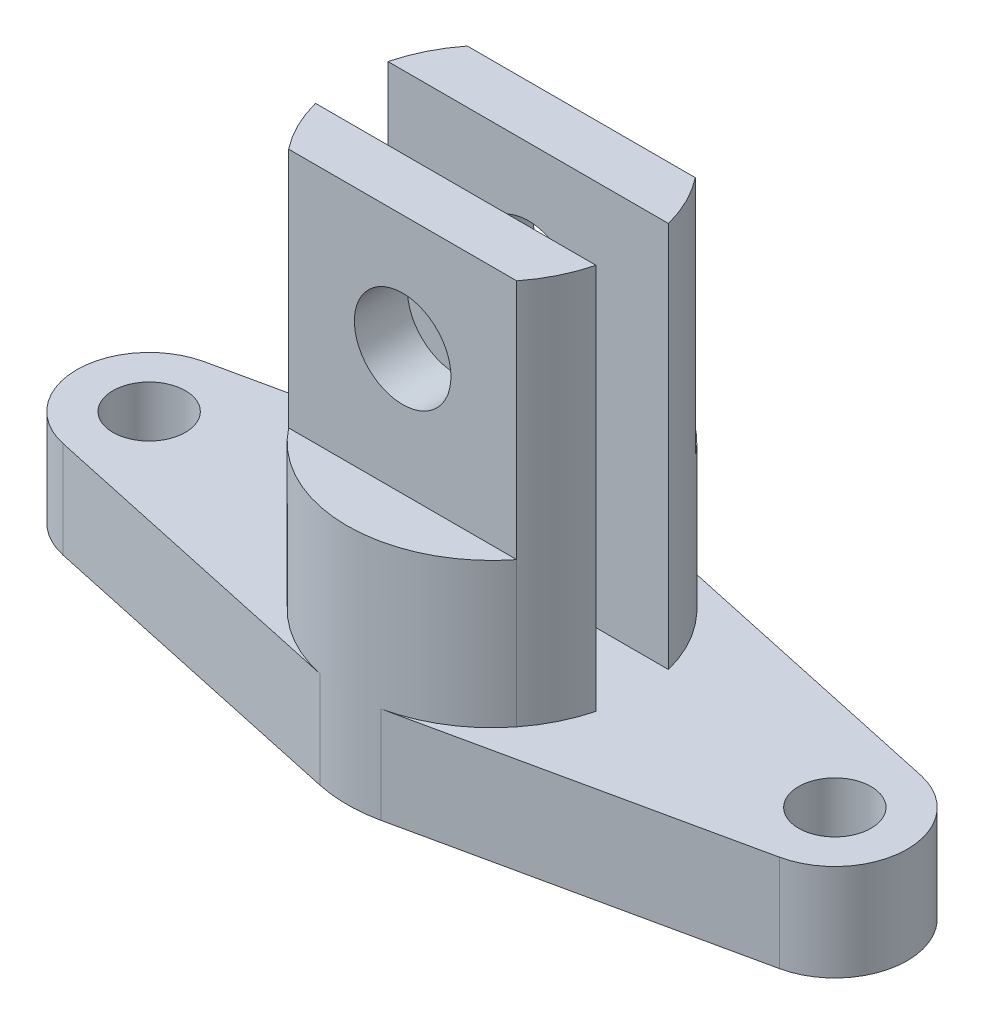
ISO-10303-21;
HEADER;
FILE_DESCRIPTION(('STEP AP214'),'2;1');
FILE_NAME('part.step','',(''),(''),'','','');
FILE_SCHEMA(('AUTOMOTIVE_DESIGN { 1 0 10303 214 1 1 1 1 }'));
ENDSEC;
DATA;
#1=APPLICATION_CONTEXT('core data for automotive mechanical design processes');
#2=APPLICATION_PROTOCOL_DEFINITION('international standard','automotive_design',2000,#1);
#3=PRODUCT_CONTEXT('',#1,'mechanical');
#4=PRODUCT('Part','Part','',(#3));
#5=PRODUCT_RELATED_PRODUCT_CATEGORY('part','',(#4));
#6=PRODUCT_DEFINITION_FORMATION('','',#4);
#7=PRODUCT_DEFINITION_CONTEXT('part definition',#1,'design');
#8=PRODUCT_DEFINITION('design','',#6,#7);
#9=PRODUCT_DEFINITION_SHAPE('','',#8);
#10=(LENGTH_UNIT() NAMED_UNIT(*) SI_UNIT(.MILLI.,.METRE.));
#11=(NAMED_UNIT(*) PLANE_ANGLE_UNIT() SI_UNIT($,.RADIAN.));
#12=(NAMED_UNIT(*) SI_UNIT($,.STERADIAN.) SOLID_ANGLE_UNIT());
#13=UNCERTAINTY_MEASURE_WITH_UNIT(LENGTH_MEASURE(1.E-05),#10,'distance_accuracy_value','');
#14=(GEOMETRIC_REPRESENTATION_CONTEXT(3) GLOBAL_UNCERTAINTY_ASSIGNED_CONTEXT((#13)) GLOBAL_UNIT_ASSIGNED_CONTEXT((#10,
#11,#12)) REPRESENTATION_CONTEXT('',''));
#15=CARTESIAN_POINT('',(0.,0.,0.));
#16=DIRECTION('',(0.,0.,1.));
#17=DIRECTION('',(1.,0.,0.));
#18=AXIS2_PLACEMENT_3D('',#15,#16,#17);
#19=CARTESIAN_POINT('',(0.,20.,0.));
#20=DIRECTION('',(0.,1.,0.));
#21=DIRECTION('',(0.,0.,1.));
#22=AXIS2_PLACEMENT_3D('',#19,#20,#21);
#23=PLANE('',#22);
#24=CARTESIAN_POINT('',(0.,20.,0.));
#25=DIRECTION('',(0.,1.,0.));
#26=DIRECTION('',(0.,0.,1.));
#27=AXIS2_PLACEMENT_3D('',#24,#25,#26);
#28=CIRCLE('',#27,30.);
#29=CARTESIAN_POINT('',(-29.0473750965556,20.,7.50000000000001));
#30=VERTEX_POINT('',#29);
#31=CARTESIAN_POINT('',(-6.33802816901409,20.,29.3228477288408));
#32=VERTEX_POINT('',#31);
#33=EDGE_CURVE('E289',#30,#32,#28,.T.);
#34=ORIENTED_EDGE('',*,*,#33,.F.);
#35=DIRECTION('',(1.,0.,0.));
#36=VECTOR('',#35,1.);
#37=CARTESIAN_POINT('',(-29.0473750965556,20.,7.50000000000001));
#38=LINE('',#37,#36);
#39=CARTESIAN_POINT('',(29.0473750965556,20.,7.49999999999998));
#40=VERTEX_POINT('',#39);
#41=EDGE_CURVE('E501',#30,#40,#38,.T.);
#42=ORIENTED_EDGE('',*,*,#41,.T.);
#43=CARTESIAN_POINT('',(-4.60295909374131E-06,20.,-2.27245735076598E-06));
#44=DIRECTION('',(0.,-1.,0.));
#45=DIRECTION('',(0.,0.,-1.));
#46=AXIS2_PLACEMENT_3D('',#43,#44,#45);
#47=CIRCLE('',#46,30.0000050249103);
#48=CARTESIAN_POINT('',(23.6167313572391,20.,18.5));
#49=VERTEX_POINT('',#48);
#50=EDGE_CURVE('E497',#40,#49,#47,.T.);
#51=ORIENTED_EDGE('',*,*,#50,.T.);
#52=CARTESIAN_POINT('',(0.,20.,0.));
#53=DIRECTION('',(0.,1.,0.));
#54=DIRECTION('',(0.,0.,1.));
#55=AXIS2_PLACEMENT_3D('',#52,#53,#54);
#56=CIRCLE('',#55,30.);
#57=CARTESIAN_POINT('',(6.33802816901409,20.,29.3228477288408));
#58=VERTEX_POINT('',#57);
#59=EDGE_CURVE('E11',#49,#58,#56,.F.);
#60=ORIENTED_EDGE('',*,*,#59,.T.);
#61=DIRECTION('',(0.977428257628027,0.,-0.211267605633803));
#62=VECTOR('',#61,1.);
#63=CARTESIAN_POINT('',(6.33802816901409,20.,29.3228477288408));
#64=LINE('',#63,#62);
#65=CARTESIAN_POINT('',(74.169014084507,20.,14.6614238644204));
#66=VERTEX_POINT('',#65);
#67=EDGE_CURVE('E251',#58,#66,#64,.T.);
#68=ORIENTED_EDGE('',*,*,#67,.T.);
#69=CARTESIAN_POINT('',(71.,20.,0.));
#70=DIRECTION('',(0.,1.,0.));
#71=DIRECTION('',(0.,0.,1.));
#72=AXIS2_PLACEMENT_3D('',#69,#70,#71);
#73=CIRCLE('',#72,15.);
#74=CARTESIAN_POINT('',(74.169014084507,20.,-14.6614238644204));
#75=VERTEX_POINT('',#74);
#76=EDGE_CURVE('E109',#66,#75,#73,.T.);
#77=ORIENTED_EDGE('',*,*,#76,.T.);
#78=DIRECTION('',(0.977428257628027,0.,0.211267605633803));
#79=VECTOR('',#78,1.);
#80=CARTESIAN_POINT('',(6.33802816901407,20.,-29.3228477288408));
#81=LINE('',#80,#79);
#82=CARTESIAN_POINT('',(6.33802816901407,20.,-29.3228477288408));
#83=VERTEX_POINT('',#82);
#84=EDGE_CURVE('E150',#83,#75,#81,.T.);
#85=ORIENTED_EDGE('',*,*,#84,.F.);
#86=CARTESIAN_POINT('',(0.,20.,0.));
#87=DIRECTION('',(0.,1.,0.));
#88=DIRECTION('',(0.,0.,1.));
#89=AXIS2_PLACEMENT_3D('',#86,#87,#88);
#90=CIRCLE('',#89,30.);
#91=CARTESIAN_POINT('',(29.0473750965556,20.,-7.5));
#92=VERTEX_POINT('',#91);
#93=EDGE_CURVE('E135',#92,#83,#90,.T.);
#94=ORIENTED_EDGE('',*,*,#93,.F.);
#95=DIRECTION('',(1.,0.,0.));
#96=VECTOR('',#95,1.);
#97=CARTESIAN_POINT('',(0.,20.,-7.5));
#98=LINE('',#97,#96);
#99=CARTESIAN_POINT('',(-29.0473750965556,20.,-7.49999999999999));
#100=VERTEX_POINT('',#99);
#101=EDGE_CURVE('E128',#100,#92,#98,.T.);
#102=ORIENTED_EDGE('',*,*,#101,.F.);
#103=CARTESIAN_POINT('',(-6.33802816901409,20.,-29.3228477288408));
#104=VERTEX_POINT('',#103);
#105=EDGE_CURVE('E54',#104,#100,#90,.T.);
#106=ORIENTED_EDGE('',*,*,#105,.F.);
#107=DIRECTION('',(0.977428257628027,0.,-0.211267605633803));
#108=VECTOR('',#107,1.);
#109=CARTESIAN_POINT('',(-6.33802816901409,20.,-29.3228477288408));
#110=LINE('',#109,#108);
#111=CARTESIAN_POINT('',(-74.169014084507,20.,-14.6614238644204));
#112=VERTEX_POINT('',#111);
#113=EDGE_CURVE('E124',#112,#104,#110,.T.);
#114=ORIENTED_EDGE('',*,*,#113,.F.);
#115=CARTESIAN_POINT('',(-71.,20.,0.));
#116=DIRECTION('',(0.,1.,0.));
#117=DIRECTION('',(0.,0.,1.));
#118=AXIS2_PLACEMENT_3D('',#115,#116,#117);
#119=CIRCLE('',#118,15.);
#120=CARTESIAN_POINT('',(-74.169014084507,20.,14.6614238644204));
#121=VERTEX_POINT('',#120);
#122=EDGE_CURVE('E62',#112,#121,#119,.T.);
#123=ORIENTED_EDGE('',*,*,#122,.T.);
#124=DIRECTION('',(0.977428257628027,0.,0.211267605633803));
#125=VECTOR('',#124,1.);
#126=CARTESIAN_POINT('',(-6.33802816901409,20.,29.3228477288408));
#127=LINE('',#126,#125);
#128=EDGE_CURVE('E154',#121,#32,#127,.T.);
#129=ORIENTED_EDGE('',*,*,#128,.T.);
#130=EDGE_LOOP('',(#34,#42,#51,#60,#68,#77,#85,#94,#102,#106,#114,#123,#129));
#131=FACE_BOUND('',#130,.T.);
#132=CARTESIAN_POINT('',(71.,20.,0.));
#133=DIRECTION('',(0.,1.,0.));
#134=DIRECTION('',(0.,0.,1.));
#135=AXIS2_PLACEMENT_3D('',#132,#133,#134);
#136=CIRCLE('',#135,7.50000000000001);
#137=CARTESIAN_POINT('',(71.,20.,7.50000000000001));
#138=VERTEX_POINT('',#137);
#139=EDGE_CURVE('E200',#138,#138,#136,.T.);
#140=ORIENTED_EDGE('',*,*,#139,.F.);
#141=EDGE_LOOP('',(#140));
#142=FACE_BOUND('',#141,.T.);
#143=CARTESIAN_POINT('',(-71.,20.,0.));
#144=DIRECTION('',(0.,1.,0.));
#145=DIRECTION('',(0.,0.,1.));
#146=AXIS2_PLACEMENT_3D('',#143,#144,#145);
#147=CIRCLE('',#146,7.5);
#148=CARTESIAN_POINT('',(-71.,20.,7.5));
#149=VERTEX_POINT('',#148);
#150=EDGE_CURVE('E162',#149,#149,#147,.T.);
#151=ORIENTED_EDGE('',*,*,#150,.F.);
#152=EDGE_LOOP('',(#151));
#153=FACE_BOUND('',#152,.T.);
#154=ADVANCED_FACE('F43',(#131,#142,#153),#23,.T.);
#155=CARTESIAN_POINT('',(6.33802816901409,20.,29.3228477288408));
#156=DIRECTION('',(-0.211267605633803,0.,-0.977428257628027));
#157=DIRECTION('',(-0.977428257628027,0.,0.211267605633803));
#158=AXIS2_PLACEMENT_3D('',#155,#156,#157);
#159=PLANE('',#158);
#160=DIRECTION('',(0.977428257628027,0.,-0.211267605633803));
#161=VECTOR('',#160,1.);
#162=CARTESIAN_POINT('',(6.33802816901409,0.,29.3228477288408));
#163=LINE('',#162,#161);
#164=CARTESIAN_POINT('',(6.33802816901409,0.,29.3228477288408));
#165=VERTEX_POINT('',#164);
#166=CARTESIAN_POINT('',(74.169014084507,0.,14.6614238644204));
#167=VERTEX_POINT('',#166);
#168=EDGE_CURVE('E171',#165,#167,#163,.T.);
#169=ORIENTED_EDGE('',*,*,#168,.T.);
#170=DIRECTION('',(0.,-1.,0.));
#171=VECTOR('',#170,1.);
#172=CARTESIAN_POINT('',(74.169014084507,20.,14.6614238644204));
#173=LINE('',#172,#171);
#174=EDGE_CURVE('E133',#66,#167,#173,.T.);
#175=ORIENTED_EDGE('',*,*,#174,.F.);
#176=ORIENTED_EDGE('',*,*,#67,.F.);
#177=DIRECTION('',(0.,-1.,0.));
#178=VECTOR('',#177,1.);
#179=CARTESIAN_POINT('',(6.33802816901409,20.,29.3228477288408));
#180=LINE('',#179,#178);
#181=EDGE_CURVE('E166',#58,#165,#180,.T.);
#182=ORIENTED_EDGE('',*,*,#181,.T.);
#183=EDGE_LOOP('',(#169,#175,#176,#182));
#184=FACE_BOUND('',#183,.T.);
#185=ADVANCED_FACE('F222',(#184),#159,.F.);
#186=CARTESIAN_POINT('',(71.,20.,0.));
#187=DIRECTION('',(0.,-1.,0.));
#188=DIRECTION('',(0.,0.,-1.));
#189=AXIS2_PLACEMENT_3D('',#186,#187,#188);
#190=CYLINDRICAL_SURFACE('',#189,15.);
#191=CARTESIAN_POINT('',(71.,0.,0.));
#192=DIRECTION('',(0.,1.,0.));
#193=DIRECTION('',(0.,0.,1.));
#194=AXIS2_PLACEMENT_3D('',#191,#192,#193);
#195=CIRCLE('',#194,15.);
#196=CARTESIAN_POINT('',(74.169014084507,0.,-14.6614238644204));
#197=VERTEX_POINT('',#196);
#198=EDGE_CURVE('E176',#167,#197,#195,.T.);
#199=ORIENTED_EDGE('',*,*,#198,.T.);
#200=DIRECTION('',(0.,-1.,0.));
#201=VECTOR('',#200,1.);
#202=CARTESIAN_POINT('',(74.169014084507,20.,-14.6614238644204));
#203=LINE('',#202,#201);
#204=EDGE_CURVE('E213',#75,#197,#203,.T.);
#205=ORIENTED_EDGE('',*,*,#204,.F.);
#206=ORIENTED_EDGE('',*,*,#76,.F.);
#207=ORIENTED_EDGE('',*,*,#174,.T.);
#208=EDGE_LOOP('',(#199,#205,#206,#207));
#209=FACE_BOUND('',#208,.T.);
#210=ADVANCED_FACE('F218',(#209),#190,.T.);
#211=CARTESIAN_POINT('',(6.33802816901407,20.,-29.3228477288408));
#212=DIRECTION('',(0.211267605633802,0.,-0.977428257628027));
#213=DIRECTION('',(-0.977428257628027,0.,-0.211267605633802));
#214=AXIS2_PLACEMENT_3D('',#211,#212,#213);
#215=PLANE('',#214);
#216=DIRECTION('',(0.977428257628027,0.,0.211267605633803));
#217=VECTOR('',#216,1.);
#218=CARTESIAN_POINT('',(6.33802816901407,0.,-29.3228477288408));
#219=LINE('',#218,#217);
#220=CARTESIAN_POINT('',(6.33802816901407,0.,-29.3228477288408));
#221=VERTEX_POINT('',#220);
#222=EDGE_CURVE('E180',#221,#197,#219,.T.);
#223=ORIENTED_EDGE('',*,*,#222,.F.);
#224=DIRECTION('',(0.,-1.,0.));
#225=VECTOR('',#224,1.);
#226=CARTESIAN_POINT('',(6.33802816901407,20.,-29.3228477288408));
#227=LINE('',#226,#225);
#228=EDGE_CURVE('E145',#83,#221,#227,.T.);
#229=ORIENTED_EDGE('',*,*,#228,.F.);
#230=ORIENTED_EDGE('',*,*,#84,.T.);
#231=ORIENTED_EDGE('',*,*,#204,.T.);
#232=EDGE_LOOP('',(#223,#229,#230,#231));
#233=FACE_BOUND('',#232,.T.);
#234=ADVANCED_FACE('F228',(#233),#215,.T.);
#235=CARTESIAN_POINT('',(0.,20.,0.));
#236=DIRECTION('',(0.,-1.,0.));
#237=DIRECTION('',(0.,0.,-1.));
#238=AXIS2_PLACEMENT_3D('',#235,#236,#237);
#239=CYLINDRICAL_SURFACE('',#238,30.);
#240=CARTESIAN_POINT('',(0.,0.,0.));
#241=DIRECTION('',(0.,1.,0.));
#242=DIRECTION('',(0.,0.,1.));
#243=AXIS2_PLACEMENT_3D('',#240,#241,#242);
#244=CIRCLE('',#243,30.);
#245=CARTESIAN_POINT('',(-6.33802816901409,0.,-29.3228477288408));
#246=VERTEX_POINT('',#245);
#247=EDGE_CURVE('E140',#221,#246,#244,.T.);
#248=ORIENTED_EDGE('',*,*,#247,.T.);
#249=DIRECTION('',(0.,-1.,0.));
#250=VECTOR('',#249,1.);
#251=CARTESIAN_POINT('',(-6.33802816901409,20.,-29.3228477288408));
#252=LINE('',#251,#250);
#253=EDGE_CURVE('E137',#104,#246,#252,.T.);
#254=ORIENTED_EDGE('',*,*,#253,.F.);
#255=ORIENTED_EDGE('',*,*,#105,.T.);
#256=DIRECTION('',(0.,-1.,0.));
#257=VECTOR('',#256,1.);
#258=CARTESIAN_POINT('',(-29.0473750965556,100.,-7.49999999999999));
#259=LINE('',#258,#257);
#260=CARTESIAN_POINT('',(-29.0473750965556,100.,-7.49999999999999));
#261=VERTEX_POINT('',#260);
#262=EDGE_CURVE('E279',#261,#100,#259,.T.);
#263=ORIENTED_EDGE('',*,*,#262,.F.);
#264=CARTESIAN_POINT('',(0.,100.,0.));
#265=DIRECTION('',(0.,1.,0.));
#266=DIRECTION('',(0.,0.,1.));
#267=AXIS2_PLACEMENT_3D('',#264,#265,#266);
#268=CIRCLE('',#267,30.);
#269=CARTESIAN_POINT('',(-23.6167313572391,100.,-18.5));
#270=VERTEX_POINT('',#269);
#271=EDGE_CURVE('E274',#270,#261,#268,.T.);
#272=ORIENTED_EDGE('',*,*,#271,.F.);
#273=DIRECTION('',(0.,-1.,0.));
#274=VECTOR('',#273,1.);
#275=CARTESIAN_POINT('',(-23.6167313572391,100.,-18.5));
#276=LINE('',#275,#274);
#277=CARTESIAN_POINT('',(-23.6167313572391,50.,-18.5));
#278=VERTEX_POINT('',#277);
#279=EDGE_CURVE('E271',#270,#278,#276,.T.);
#280=ORIENTED_EDGE('',*,*,#279,.T.);
#281=CARTESIAN_POINT('',(0.,50.,0.));
#282=DIRECTION('',(0.,1.,0.));
#283=DIRECTION('',(0.,0.,1.));
#284=AXIS2_PLACEMENT_3D('',#281,#282,#283);
#285=CIRCLE('',#284,30.);
#286=CARTESIAN_POINT('',(23.6167313572391,50.,-18.5));
#287=VERTEX_POINT('',#286);
#288=EDGE_CURVE('E237',#287,#278,#285,.T.);
#289=ORIENTED_EDGE('',*,*,#288,.F.);
#290=DIRECTION('',(0.,-1.,0.));
#291=VECTOR('',#290,1.);
#292=CARTESIAN_POINT('',(23.6167313572391,100.,-18.5));
#293=LINE('',#292,#291);
#294=CARTESIAN_POINT('',(23.6167313572391,100.,-18.5));
#295=VERTEX_POINT('',#294);
#296=EDGE_CURVE('E268',#295,#287,#293,.T.);
#297=ORIENTED_EDGE('',*,*,#296,.F.);
#298=CARTESIAN_POINT('',(29.0473750965556,100.,-7.5));
#299=VERTEX_POINT('',#298);
#300=EDGE_CURVE('E522',#299,#295,#268,.T.);
#301=ORIENTED_EDGE('',*,*,#300,.F.);
#302=DIRECTION('',(0.,-1.,0.));
#303=VECTOR('',#302,1.);
#304=CARTESIAN_POINT('',(29.0473750965556,100.,-7.5));
#305=LINE('',#304,#303);
#306=EDGE_CURVE('E235',#299,#92,#305,.T.);
#307=ORIENTED_EDGE('',*,*,#306,.T.);
#308=ORIENTED_EDGE('',*,*,#93,.T.);
#309=ORIENTED_EDGE('',*,*,#228,.T.);
#310=EDGE_LOOP('',(#248,#254,#255,#263,#272,#280,#289,#297,#301,#307,#308,#309));
#311=FACE_BOUND('',#310,.T.);
#312=ADVANCED_FACE('F138',(#311),#239,.T.);
#313=CARTESIAN_POINT('',(-6.33802816901409,20.,-29.3228477288408));
#314=DIRECTION('',(-0.211267605633803,0.,-0.977428257628027));
#315=DIRECTION('',(-0.977428257628027,0.,0.211267605633803));
#316=AXIS2_PLACEMENT_3D('',#313,#314,#315);
#317=PLANE('',#316);
#318=DIRECTION('',(0.977428257628027,0.,-0.211267605633803));
#319=VECTOR('',#318,1.);
#320=CARTESIAN_POINT('',(-6.33802816901409,0.,-29.3228477288408));
#321=LINE('',#320,#319);
#322=CARTESIAN_POINT('',(-74.169014084507,0.,-14.6614238644204));
#323=VERTEX_POINT('',#322);
#324=EDGE_CURVE('E186',#323,#246,#321,.T.);
#325=ORIENTED_EDGE('',*,*,#324,.F.);
#326=DIRECTION('',(0.,-1.,0.));
#327=VECTOR('',#326,1.);
#328=CARTESIAN_POINT('',(-74.169014084507,20.,-14.6614238644204));
#329=LINE('',#328,#327);
#330=EDGE_CURVE('E146',#112,#323,#329,.T.);
#331=ORIENTED_EDGE('',*,*,#330,.F.);
#332=ORIENTED_EDGE('',*,*,#113,.T.);
#333=ORIENTED_EDGE('',*,*,#253,.T.);
#334=EDGE_LOOP('',(#325,#331,#332,#333));
#335=FACE_BOUND('',#334,.T.);
#336=ADVANCED_FACE('F148',(#335),#317,.T.);
#337=CARTESIAN_POINT('',(-71.,20.,0.));
#338=DIRECTION('',(0.,-1.,0.));
#339=DIRECTION('',(0.,0.,-1.));
#340=AXIS2_PLACEMENT_3D('',#337,#338,#339);
#341=CYLINDRICAL_SURFACE('',#340,15.);
#342=CARTESIAN_POINT('',(-71.,0.,0.));
#343=DIRECTION('',(0.,1.,0.));
#344=DIRECTION('',(0.,0.,1.));
#345=AXIS2_PLACEMENT_3D('',#342,#343,#344);
#346=CIRCLE('',#345,15.);
#347=CARTESIAN_POINT('',(-74.169014084507,0.,14.6614238644204));
#348=VERTEX_POINT('',#347);
#349=EDGE_CURVE('E189',#323,#348,#346,.T.);
#350=ORIENTED_EDGE('',*,*,#349,.T.);
#351=DIRECTION('',(0.,-1.,0.));
#352=VECTOR('',#351,1.);
#353=CARTESIAN_POINT('',(-74.169014084507,20.,14.6614238644204));
#354=LINE('',#353,#352);
#355=EDGE_CURVE('E206',#121,#348,#354,.T.);
#356=ORIENTED_EDGE('',*,*,#355,.F.);
#357=ORIENTED_EDGE('',*,*,#122,.F.);
#358=ORIENTED_EDGE('',*,*,#330,.T.);
#359=EDGE_LOOP('',(#350,#356,#357,#358));
#360=FACE_BOUND('',#359,.T.);
#361=ADVANCED_FACE('F312',(#360),#341,.T.);
#362=CARTESIAN_POINT('',(-6.33802816901409,20.,29.3228477288408));
#363=DIRECTION('',(0.211267605633803,0.,-0.977428257628027));
#364=DIRECTION('',(-0.977428257628027,0.,-0.211267605633803));
#365=AXIS2_PLACEMENT_3D('',#362,#363,#364);
#366=PLANE('',#365);
#367=DIRECTION('',(0.977428257628027,0.,0.211267605633803));
#368=VECTOR('',#367,1.);
#369=CARTESIAN_POINT('',(-6.33802816901409,0.,29.3228477288408));
#370=LINE('',#369,#368);
#371=CARTESIAN_POINT('',(-6.33802816901409,0.,29.3228477288408));
#372=VERTEX_POINT('',#371);
#373=EDGE_CURVE('E93',#348,#372,#370,.T.);
#374=ORIENTED_EDGE('',*,*,#373,.T.);
#375=DIRECTION('',(0.,-1.,0.));
#376=VECTOR('',#375,1.);
#377=CARTESIAN_POINT('',(-6.33802816901409,20.,29.3228477288408));
#378=LINE('',#377,#376);
#379=EDGE_CURVE('E203',#32,#372,#378,.T.);
#380=ORIENTED_EDGE('',*,*,#379,.F.);
#381=ORIENTED_EDGE('',*,*,#128,.F.);
#382=ORIENTED_EDGE('',*,*,#355,.T.);
#383=EDGE_LOOP('',(#374,#380,#381,#382));
#384=FACE_BOUND('',#383,.T.);
#385=ADVANCED_FACE('F310',(#384),#366,.F.);
#386=CARTESIAN_POINT('',(0.,20.,0.));
#387=DIRECTION('',(0.,-1.,0.));
#388=DIRECTION('',(0.,0.,-1.));
#389=AXIS2_PLACEMENT_3D('',#386,#387,#388);
#390=CYLINDRICAL_SURFACE('',#389,30.);
#391=CARTESIAN_POINT('',(0.,0.,0.));
#392=DIRECTION('',(0.,1.,0.));
#393=DIRECTION('',(0.,0.,1.));
#394=AXIS2_PLACEMENT_3D('',#391,#392,#393);
#395=CIRCLE('',#394,30.);
#396=EDGE_CURVE('E100',#372,#165,#395,.T.);
#397=ORIENTED_EDGE('',*,*,#396,.T.);
#398=ORIENTED_EDGE('',*,*,#181,.F.);
#399=ORIENTED_EDGE('',*,*,#59,.F.);
#400=DIRECTION('',(0.,-1.,0.));
#401=VECTOR('',#400,1.);
#402=CARTESIAN_POINT('',(23.6167313572391,50.,18.5));
#403=LINE('',#402,#401);
#404=CARTESIAN_POINT('',(23.6167313572391,50.,18.5));
#405=VERTEX_POINT('',#404);
#406=EDGE_CURVE('E238',#405,#49,#403,.T.);
#407=ORIENTED_EDGE('',*,*,#406,.F.);
#408=CARTESIAN_POINT('',(0.,50.,0.));
#409=DIRECTION('',(0.,1.,0.));
#410=DIRECTION('',(0.,0.,1.));
#411=AXIS2_PLACEMENT_3D('',#408,#409,#410);
#412=CIRCLE('',#411,30.);
#413=CARTESIAN_POINT('',(-23.6167313572391,50.,18.5));
#414=VERTEX_POINT('',#413);
#415=EDGE_CURVE('E290',#414,#405,#412,.T.);
#416=ORIENTED_EDGE('',*,*,#415,.F.);
#417=DIRECTION('',(0.,-1.,0.));
#418=VECTOR('',#417,1.);
#419=CARTESIAN_POINT('',(-23.6167313572391,100.,18.5));
#420=LINE('',#419,#418);
#421=CARTESIAN_POINT('',(-23.6167313572391,100.,18.5));
#422=VERTEX_POINT('',#421);
#423=EDGE_CURVE('E477',#422,#414,#420,.T.);
#424=ORIENTED_EDGE('',*,*,#423,.F.);
#425=CARTESIAN_POINT('',(-1.94289029309402E-13,100.,1.38777878078145E-13));
#426=DIRECTION('',(0.,-1.,0.));
#427=DIRECTION('',(0.,0.,-1.));
#428=AXIS2_PLACEMENT_3D('',#425,#426,#427);
#429=CIRCLE('',#428,29.9999999999998);
#430=CARTESIAN_POINT('',(-29.0473750965556,100.,7.50000000000001));
#431=VERTEX_POINT('',#430);
#432=EDGE_CURVE('E502',#422,#431,#429,.T.);
#433=ORIENTED_EDGE('',*,*,#432,.T.);
#434=DIRECTION('',(0.,-1.,0.));
#435=VECTOR('',#434,1.);
#436=CARTESIAN_POINT('',(-29.0473750965556,100.,7.50000000000001));
#437=LINE('',#436,#435);
#438=EDGE_CURVE('E305',#431,#30,#437,.T.);
#439=ORIENTED_EDGE('',*,*,#438,.T.);
#440=ORIENTED_EDGE('',*,*,#33,.T.);
#441=ORIENTED_EDGE('',*,*,#379,.T.);
#442=EDGE_LOOP('',(#397,#398,#399,#407,#416,#424,#433,#439,#440,#441));
#443=FACE_BOUND('',#442,.T.);
#444=ADVANCED_FACE('F301',(#443),#390,.T.);
#445=CARTESIAN_POINT('',(71.,20.,0.));
#446=DIRECTION('',(0.,-1.,0.));
#447=DIRECTION('',(0.,0.,-1.));
#448=AXIS2_PLACEMENT_3D('',#445,#446,#447);
#449=CYLINDRICAL_SURFACE('',#448,7.50000000000001);
#450=ORIENTED_EDGE('',*,*,#139,.T.);
#451=EDGE_LOOP('',(#450));
#452=FACE_BOUND('',#451,.T.);
#453=CARTESIAN_POINT('',(71.,0.,0.));
#454=DIRECTION('',(0.,1.,0.));
#455=DIRECTION('',(0.,0.,1.));
#456=AXIS2_PLACEMENT_3D('',#453,#454,#455);
#457=CIRCLE('',#456,7.50000000000001);
#458=CARTESIAN_POINT('',(71.,0.,7.50000000000001));
#459=VERTEX_POINT('',#458);
#460=EDGE_CURVE('E167',#459,#459,#457,.T.);
#461=ORIENTED_EDGE('',*,*,#460,.F.);
#462=EDGE_LOOP('',(#461));
#463=FACE_BOUND('',#462,.T.);
#464=ADVANCED_FACE('F45',(#452,#463),#449,.F.);
#465=CARTESIAN_POINT('',(-71.,20.,0.));
#466=DIRECTION('',(0.,-1.,0.));
#467=DIRECTION('',(0.,0.,-1.));
#468=AXIS2_PLACEMENT_3D('',#465,#466,#467);
#469=CYLINDRICAL_SURFACE('',#468,7.5);
#470=ORIENTED_EDGE('',*,*,#150,.T.);
#471=EDGE_LOOP('',(#470));
#472=FACE_BOUND('',#471,.T.);
#473=CARTESIAN_POINT('',(-71.,0.,0.));
#474=DIRECTION('',(0.,1.,0.));
#475=DIRECTION('',(0.,0.,1.));
#476=AXIS2_PLACEMENT_3D('',#473,#474,#475);
#477=CIRCLE('',#476,7.5);
#478=CARTESIAN_POINT('',(-71.,0.,7.5));
#479=VERTEX_POINT('',#478);
#480=EDGE_CURVE('E196',#479,#479,#477,.T.);
#481=ORIENTED_EDGE('',*,*,#480,.F.);
#482=EDGE_LOOP('',(#481));
#483=FACE_BOUND('',#482,.T.);
#484=ADVANCED_FACE('F331',(#472,#483),#469,.F.);
#485=CARTESIAN_POINT('',(0.,0.,0.));
#486=DIRECTION('',(0.,1.,0.));
#487=DIRECTION('',(0.,0.,1.));
#488=AXIS2_PLACEMENT_3D('',#485,#486,#487);
#489=PLANE('',#488);
#490=ORIENTED_EDGE('',*,*,#460,.T.);
#491=EDGE_LOOP('',(#490));
#492=FACE_BOUND('',#491,.T.);
#493=ORIENTED_EDGE('',*,*,#168,.F.);
#494=ORIENTED_EDGE('',*,*,#396,.F.);
#495=ORIENTED_EDGE('',*,*,#373,.F.);
#496=ORIENTED_EDGE('',*,*,#349,.F.);
#497=ORIENTED_EDGE('',*,*,#324,.T.);
#498=ORIENTED_EDGE('',*,*,#247,.F.);
#499=ORIENTED_EDGE('',*,*,#222,.T.);
#500=ORIENTED_EDGE('',*,*,#198,.F.);
#501=EDGE_LOOP('',(#493,#494,#495,#496,#497,#498,#499,#500));
#502=FACE_BOUND('',#501,.T.);
#503=ORIENTED_EDGE('',*,*,#480,.T.);
#504=EDGE_LOOP('',(#503));
#505=FACE_BOUND('',#504,.T.);
#506=ADVANCED_FACE('F224',(#492,#502,#505),#489,.F.);
#507=CARTESIAN_POINT('',(0.,50.,0.));
#508=DIRECTION('',(0.,1.,0.));
#509=DIRECTION('',(0.,0.,1.));
#510=AXIS2_PLACEMENT_3D('',#507,#508,#509);
#511=PLANE('',#510);
#512=ORIENTED_EDGE('',*,*,#288,.T.);
#513=DIRECTION('',(1.,0.,0.));
#514=VECTOR('',#513,1.);
#515=CARTESIAN_POINT('',(-23.6167313572391,50.,-18.5));
#516=LINE('',#515,#514);
#517=EDGE_CURVE('E172',#278,#287,#516,.T.);
#518=ORIENTED_EDGE('',*,*,#517,.T.);
#519=EDGE_LOOP('',(#512,#518));
#520=FACE_BOUND('',#519,.T.);
#521=ADVANCED_FACE('F259',(#520),#511,.T.);
#522=CARTESIAN_POINT('',(0.,50.,0.));
#523=DIRECTION('',(0.,1.,0.));
#524=DIRECTION('',(0.,0.,1.));
#525=AXIS2_PLACEMENT_3D('',#522,#523,#524);
#526=PLANE('',#525);
#527=ORIENTED_EDGE('',*,*,#415,.T.);
#528=DIRECTION('',(-1.,0.,0.));
#529=VECTOR('',#528,1.);
#530=CARTESIAN_POINT('',(-23.6167313572391,50.,18.5));
#531=LINE('',#530,#529);
#532=EDGE_CURVE('E244',#405,#414,#531,.T.);
#533=ORIENTED_EDGE('',*,*,#532,.T.);
#534=EDGE_LOOP('',(#527,#533));
#535=FACE_BOUND('',#534,.T.);
#536=ADVANCED_FACE('F368',(#535),#526,.T.);
#537=CARTESIAN_POINT('',(0.,100.,-7.5));
#538=DIRECTION('',(0.,0.,-1.));
#539=DIRECTION('',(-1.,0.,0.));
#540=AXIS2_PLACEMENT_3D('',#537,#538,#539);
#541=PLANE('',#540);
#542=CARTESIAN_POINT('',(0.,76.,-7.5));
#543=DIRECTION('',(0.,0.,-1.));
#544=DIRECTION('',(-1.,0.,0.));
#545=AXIS2_PLACEMENT_3D('',#542,#543,#544);
#546=CIRCLE('',#545,10.);
#547=CARTESIAN_POINT('',(10.,76.,-7.5));
#548=VERTEX_POINT('',#547);
#549=EDGE_CURVE('E475',#548,#548,#546,.T.);
#550=ORIENTED_EDGE('',*,*,#549,.T.);
#551=EDGE_LOOP('',(#550));
#552=FACE_BOUND('',#551,.T.);
#553=ORIENTED_EDGE('',*,*,#101,.T.);
#554=ORIENTED_EDGE('',*,*,#306,.F.);
#555=DIRECTION('',(1.,0.,0.));
#556=VECTOR('',#555,1.);
#557=CARTESIAN_POINT('',(0.,100.,-7.5));
#558=LINE('',#557,#556);
#559=EDGE_CURVE('E518',#261,#299,#558,.T.);
#560=ORIENTED_EDGE('',*,*,#559,.F.);
#561=ORIENTED_EDGE('',*,*,#262,.T.);
#562=EDGE_LOOP('',(#553,#554,#560,#561));
#563=FACE_BOUND('',#562,.T.);
#564=ADVANCED_FACE('F376',(#552,#563),#541,.F.);
#565=CARTESIAN_POINT('',(0.,100.,-18.5));
#566=DIRECTION('',(0.,0.,1.));
#567=DIRECTION('',(1.,0.,0.));
#568=AXIS2_PLACEMENT_3D('',#565,#566,#567);
#569=PLANE('',#568);
#570=CARTESIAN_POINT('',(0.,76.,-18.5));
#571=DIRECTION('',(0.,0.,1.));
#572=DIRECTION('',(1.,0.,0.));
#573=AXIS2_PLACEMENT_3D('',#570,#571,#572);
#574=CIRCLE('',#573,10.);
#575=CARTESIAN_POINT('',(10.,76.,-18.5));
#576=VERTEX_POINT('',#575);
#577=EDGE_CURVE('E472',#576,#576,#574,.T.);
#578=ORIENTED_EDGE('',*,*,#577,.T.);
#579=EDGE_LOOP('',(#578));
#580=FACE_BOUND('',#579,.T.);
#581=ORIENTED_EDGE('',*,*,#517,.F.);
#582=ORIENTED_EDGE('',*,*,#279,.F.);
#583=DIRECTION('',(-1.,0.,0.));
#584=VECTOR('',#583,1.);
#585=CARTESIAN_POINT('',(0.,100.,-18.5));
#586=LINE('',#585,#584);
#587=EDGE_CURVE('E526',#295,#270,#586,.T.);
#588=ORIENTED_EDGE('',*,*,#587,.F.);
#589=ORIENTED_EDGE('',*,*,#296,.T.);
#590=EDGE_LOOP('',(#581,#582,#588,#589));
#591=FACE_BOUND('',#590,.T.);
#592=ADVANCED_FACE('F389',(#580,#591),#569,.F.);
#593=CARTESIAN_POINT('',(0.,100.,0.));
#594=DIRECTION('',(0.,1.,0.));
#595=DIRECTION('',(0.,0.,1.));
#596=AXIS2_PLACEMENT_3D('',#593,#594,#595);
#597=PLANE('',#596);
#598=ORIENTED_EDGE('',*,*,#559,.T.);
#599=ORIENTED_EDGE('',*,*,#300,.T.);
#600=ORIENTED_EDGE('',*,*,#587,.T.);
#601=ORIENTED_EDGE('',*,*,#271,.T.);
#602=EDGE_LOOP('',(#598,#599,#600,#601));
#603=FACE_BOUND('',#602,.T.);
#604=ADVANCED_FACE('F383',(#603),#597,.T.);
#605=CARTESIAN_POINT('',(-23.6167313572391,100.,18.5));
#606=DIRECTION('',(0.,0.,-1.));
#607=DIRECTION('',(-1.,0.,0.));
#608=AXIS2_PLACEMENT_3D('',#605,#606,#607);
#609=PLANE('',#608);
#610=CARTESIAN_POINT('',(0.,76.,18.5));
#611=DIRECTION('',(0.,0.,1.));
#612=DIRECTION('',(1.,0.,0.));
#613=AXIS2_PLACEMENT_3D('',#610,#611,#612);
#614=CIRCLE('',#613,10.);
#615=CARTESIAN_POINT('',(10.,76.,18.5));
#616=VERTEX_POINT('',#615);
#617=EDGE_CURVE('E570',#616,#616,#614,.T.);
#618=ORIENTED_EDGE('',*,*,#617,.F.);
#619=EDGE_LOOP('',(#618));
#620=FACE_BOUND('',#619,.T.);
#621=ORIENTED_EDGE('',*,*,#532,.F.);
#622=DIRECTION('',(0.,-1.,0.));
#623=VECTOR('',#622,1.);
#624=CARTESIAN_POINT('',(23.6167313572391,100.,18.5));
#625=LINE('',#624,#623);
#626=CARTESIAN_POINT('',(23.6167313572391,100.,18.5));
#627=VERTEX_POINT('',#626);
#628=EDGE_CURVE('E482',#627,#405,#625,.T.);
#629=ORIENTED_EDGE('',*,*,#628,.F.);
#630=DIRECTION('',(1.,0.,0.));
#631=VECTOR('',#630,1.);
#632=CARTESIAN_POINT('',(-23.6167313572391,100.,18.5));
#633=LINE('',#632,#631);
#634=EDGE_CURVE('E489',#422,#627,#633,.T.);
#635=ORIENTED_EDGE('',*,*,#634,.F.);
#636=ORIENTED_EDGE('',*,*,#423,.T.);
#637=EDGE_LOOP('',(#621,#629,#635,#636));
#638=FACE_BOUND('',#637,.T.);
#639=ADVANCED_FACE('F388',(#620,#638),#609,.F.);
#640=CARTESIAN_POINT('',(-4.60295909374131E-06,100.,-2.27245735076598E-06));
#641=DIRECTION('',(0.,-1.,0.));
#642=DIRECTION('',(0.,0.,-1.));
#643=AXIS2_PLACEMENT_3D('',#640,#641,#642);
#644=CYLINDRICAL_SURFACE('',#643,30.0000050249103);
#645=ORIENTED_EDGE('',*,*,#50,.F.);
#646=DIRECTION('',(0.,-1.,0.));
#647=VECTOR('',#646,1.);
#648=CARTESIAN_POINT('',(29.0473750965556,100.,7.49999999999998));
#649=LINE('',#648,#647);
#650=CARTESIAN_POINT('',(29.0473750965556,100.,7.49999999999998));
#651=VERTEX_POINT('',#650);
#652=EDGE_CURVE('E490',#651,#40,#649,.T.);
#653=ORIENTED_EDGE('',*,*,#652,.F.);
#654=CARTESIAN_POINT('',(-4.60295909374131E-06,100.,-2.27245735076598E-06));
#655=DIRECTION('',(0.,-1.,0.));
#656=DIRECTION('',(0.,0.,-1.));
#657=AXIS2_PLACEMENT_3D('',#654,#655,#656);
#658=CIRCLE('',#657,30.0000050249103);
#659=EDGE_CURVE('E508',#651,#627,#658,.T.);
#660=ORIENTED_EDGE('',*,*,#659,.T.);
#661=ORIENTED_EDGE('',*,*,#628,.T.);
#662=ORIENTED_EDGE('',*,*,#406,.T.);
#663=EDGE_LOOP('',(#645,#653,#660,#661,#662));
#664=FACE_BOUND('',#663,.T.);
#665=ADVANCED_FACE('F399',(#664),#644,.T.);
#666=CARTESIAN_POINT('',(-29.0473750965556,100.,7.50000000000001));
#667=DIRECTION('',(0.,0.,-1.));
#668=DIRECTION('',(-1.,0.,0.));
#669=AXIS2_PLACEMENT_3D('',#666,#667,#668);
#670=PLANE('',#669);
#671=CARTESIAN_POINT('',(0.,76.,7.49999999999999));
#672=DIRECTION('',(0.,0.,-1.));
#673=DIRECTION('',(-1.,0.,0.));
#674=AXIS2_PLACEMENT_3D('',#671,#672,#673);
#675=CIRCLE('',#674,10.);
#676=CARTESIAN_POINT('',(10.,76.,7.49999999999999));
#677=VERTEX_POINT('',#676);
#678=EDGE_CURVE('E47',#677,#677,#675,.T.);
#679=ORIENTED_EDGE('',*,*,#678,.F.);
#680=EDGE_LOOP('',(#679));
#681=FACE_BOUND('',#680,.T.);
#682=ORIENTED_EDGE('',*,*,#41,.F.);
#683=ORIENTED_EDGE('',*,*,#438,.F.);
#684=DIRECTION('',(1.,0.,0.));
#685=VECTOR('',#684,1.);
#686=CARTESIAN_POINT('',(-29.0473750965556,100.,7.50000000000001));
#687=LINE('',#686,#685);
#688=EDGE_CURVE('E512',#431,#651,#687,.T.);
#689=ORIENTED_EDGE('',*,*,#688,.T.);
#690=ORIENTED_EDGE('',*,*,#652,.T.);
#691=EDGE_LOOP('',(#682,#683,#689,#690));
#692=FACE_BOUND('',#691,.T.);
#693=ADVANCED_FACE('F404',(#681,#692),#670,.T.);
#694=CARTESIAN_POINT('',(-1.94289029309402E-13,100.,1.38777878078145E-13));
#695=DIRECTION('',(0.,-1.,0.));
#696=DIRECTION('',(0.,0.,-1.));
#697=AXIS2_PLACEMENT_3D('',#694,#695,#696);
#698=PLANE('',#697);
#699=ORIENTED_EDGE('',*,*,#432,.F.);
#700=ORIENTED_EDGE('',*,*,#634,.T.);
#701=ORIENTED_EDGE('',*,*,#659,.F.);
#702=ORIENTED_EDGE('',*,*,#688,.F.);
#703=EDGE_LOOP('',(#699,#700,#701,#702));
#704=FACE_BOUND('',#703,.T.);
#705=ADVANCED_FACE('F412',(#704),#698,.F.);
#706=CARTESIAN_POINT('',(0.,76.,-30.));
#707=DIRECTION('',(0.,0.,1.));
#708=DIRECTION('',(1.,0.,0.));
#709=AXIS2_PLACEMENT_3D('',#706,#707,#708);
#710=CYLINDRICAL_SURFACE('',#709,10.);
#711=CARTESIAN_POINT('',(10.,76.,7.49999999999999));
#712=CARTESIAN_POINT('',(10.,76.,7.61458333333332));
#713=CARTESIAN_POINT('',(10.,76.,7.72916666666666));
#714=CARTESIAN_POINT('',(10.,76.,7.95833333333332));
#715=CARTESIAN_POINT('',(10.,76.,8.07291666666665));
#716=CARTESIAN_POINT('',(10.,76.,8.30208333333332));
#717=CARTESIAN_POINT('',(10.,76.,8.41666666666665));
#718=CARTESIAN_POINT('',(10.,76.,8.64583333333332));
#719=CARTESIAN_POINT('',(10.,76.,8.76041666666665));
#720=CARTESIAN_POINT('',(10.,76.,8.98958333333332));
#721=CARTESIAN_POINT('',(10.,76.,9.10416666666666));
#722=CARTESIAN_POINT('',(10.,76.,9.33333333333332));
#723=CARTESIAN_POINT('',(10.,76.,9.44791666666666));
#724=CARTESIAN_POINT('',(10.,76.,9.67708333333332));
#725=CARTESIAN_POINT('',(10.,76.,9.79166666666665));
#726=CARTESIAN_POINT('',(10.,76.,10.0208333333333));
#727=CARTESIAN_POINT('',(10.,76.,10.1354166666667));
#728=CARTESIAN_POINT('',(10.,76.,10.3645833333333));
#729=CARTESIAN_POINT('',(10.,76.,10.4791666666667));
#730=CARTESIAN_POINT('',(10.,76.,10.7083333333333));
#731=CARTESIAN_POINT('',(10.,76.,10.8229166666667));
#732=CARTESIAN_POINT('',(10.,76.,11.0520833333333));
#733=CARTESIAN_POINT('',(10.,76.,11.1666666666667));
#734=CARTESIAN_POINT('',(10.,76.,11.3958333333333));
#735=CARTESIAN_POINT('',(10.,76.,11.5104166666667));
#736=CARTESIAN_POINT('',(10.,76.,11.7395833333333));
#737=CARTESIAN_POINT('',(10.,76.,11.8541666666667));
#738=CARTESIAN_POINT('',(10.,76.,12.0833333333333));
#739=CARTESIAN_POINT('',(10.,76.,12.1979166666667));
#740=CARTESIAN_POINT('',(10.,76.,12.4270833333333));
#741=CARTESIAN_POINT('',(10.,76.,12.5416666666667));
#742=CARTESIAN_POINT('',(10.,76.,12.7708333333333));
#743=CARTESIAN_POINT('',(10.,76.,12.8854166666667));
#744=CARTESIAN_POINT('',(10.,76.,13.1145833333333));
#745=CARTESIAN_POINT('',(10.,76.,13.2291666666667));
#746=CARTESIAN_POINT('',(10.,76.,13.4583333333333));
#747=CARTESIAN_POINT('',(10.,76.,13.5729166666667));
#748=CARTESIAN_POINT('',(10.,76.,13.8020833333333));
#749=CARTESIAN_POINT('',(10.,76.,13.9166666666667));
#750=CARTESIAN_POINT('',(10.,76.,14.1458333333333));
#751=CARTESIAN_POINT('',(10.,76.,14.2604166666667));
#752=CARTESIAN_POINT('',(10.,76.,14.4895833333333));
#753=CARTESIAN_POINT('',(10.,76.,14.6041666666667));
#754=CARTESIAN_POINT('',(10.,76.,14.8333333333333));
#755=CARTESIAN_POINT('',(10.,76.,14.9479166666667));
#756=CARTESIAN_POINT('',(10.,76.,15.1770833333333));
#757=CARTESIAN_POINT('',(10.,76.,15.2916666666667));
#758=CARTESIAN_POINT('',(10.,76.,15.5208333333333));
#759=CARTESIAN_POINT('',(10.,76.,15.6354166666667));
#760=CARTESIAN_POINT('',(10.,76.,15.8645833333333));
#761=CARTESIAN_POINT('',(10.,76.,15.9791666666667));
#762=CARTESIAN_POINT('',(10.,76.,16.2083333333333));
#763=CARTESIAN_POINT('',(10.,76.,16.3229166666667));
#764=CARTESIAN_POINT('',(10.,76.,16.5520833333333));
#765=CARTESIAN_POINT('',(10.,76.,16.6666666666667));
#766=CARTESIAN_POINT('',(10.,76.,16.8958333333333));
#767=CARTESIAN_POINT('',(10.,76.,17.0104166666667));
#768=CARTESIAN_POINT('',(10.,76.,17.2395833333333));
#769=CARTESIAN_POINT('',(10.,76.,17.3541666666667));
#770=CARTESIAN_POINT('',(10.,76.,17.5833333333333));
#771=CARTESIAN_POINT('',(10.,76.,17.6979166666667));
#772=CARTESIAN_POINT('',(10.,76.,17.9270833333333));
#773=CARTESIAN_POINT('',(10.,76.,18.0416666666667));
#774=CARTESIAN_POINT('',(10.,76.,18.2708333333333));
#775=CARTESIAN_POINT('',(10.,76.,18.3854166666667));
#776=CARTESIAN_POINT('',(10.,76.,18.5));
#777=B_SPLINE_CURVE_WITH_KNOTS('',3,(#711,#712,#713,#714,#715,#716,#717,#718,#719,#720,#721,
#722,#723,#724,#725,#726,#727,#728,#729,#730,#731,#732,#733,#734,#735,#736,#737,#738,#739,#740,
#741,#742,#743,#744,#745,#746,#747,#748,#749,#750,#751,#752,#753,#754,#755,#756,#757,#758,#759,
#760,#761,#762,#763,#764,#765,#766,#767,#768,#769,#770,#771,#772,#773,#774,#775,#776),
.UNSPECIFIED.,.F.,.F.,(4,2,2,2,2,2,2,2,2,2,2,2,2,2,2,2,2,2,2,2,2,2,2,2,2,2,2,2,2,2,2,2,4),(0.,
0.343750000000004,0.687500000000001,1.03125,1.375,1.71875,2.0625,2.40625,2.75,3.09375000000001,
3.4375,3.78125,4.125,4.46875000000001,4.8125,5.15625,5.50000000000001,5.84375000000001,
6.18750000000001,6.53125,6.87500000000001,7.21875000000001,7.56250000000001,7.90625,
8.25000000000001,8.59375000000001,8.93750000000001,9.28125000000001,9.62500000000001,
9.96875000000001,10.3125,10.65625,11.),.UNSPECIFIED.);
#778=EDGE_CURVE('BSEAM417',#677,#616,#777,.T.);
#779=ORIENTED_EDGE('',*,*,#678,.T.);
#780=ORIENTED_EDGE('',*,*,#617,.T.);
#781=ORIENTED_EDGE('',*,*,#778,.T.);
#782=ORIENTED_EDGE('',*,*,#778,.F.);
#783=EDGE_LOOP('',(#779,#781,#780,#782));
#784=FACE_BOUND('',#783,.T.);
#785=ADVANCED_FACE('F417',(#784),#710,.F.);
#786=CARTESIAN_POINT('',(10.,76.,-18.5));
#787=CARTESIAN_POINT('',(10.,76.,-18.3854166666667));
#788=CARTESIAN_POINT('',(10.,76.,-18.2708333333333));
#789=CARTESIAN_POINT('',(10.,76.,-18.0416666666667));
#790=CARTESIAN_POINT('',(10.,76.,-17.9270833333333));
#791=CARTESIAN_POINT('',(10.,76.,-17.6979166666667));
#792=CARTESIAN_POINT('',(10.,76.,-17.5833333333333));
#793=CARTESIAN_POINT('',(10.,76.,-17.3541666666667));
#794=CARTESIAN_POINT('',(10.,76.,-17.2395833333333));
#795=CARTESIAN_POINT('',(10.,76.,-17.0104166666667));
#796=CARTESIAN_POINT('',(10.,76.,-16.8958333333333));
#797=CARTESIAN_POINT('',(10.,76.,-16.6666666666667));
#798=CARTESIAN_POINT('',(10.,76.,-16.5520833333333));
#799=CARTESIAN_POINT('',(10.,76.,-16.3229166666667));
#800=CARTESIAN_POINT('',(10.,76.,-16.2083333333333));
#801=CARTESIAN_POINT('',(10.,76.,-15.9791666666667));
#802=CARTESIAN_POINT('',(10.,76.,-15.8645833333333));
#803=CARTESIAN_POINT('',(10.,76.,-15.6354166666667));
#804=CARTESIAN_POINT('',(10.,76.,-15.5208333333333));
#805=CARTESIAN_POINT('',(10.,76.,-15.2916666666667));
#806=CARTESIAN_POINT('',(10.,76.,-15.1770833333333));
#807=CARTESIAN_POINT('',(10.,76.,-14.9479166666667));
#808=CARTESIAN_POINT('',(10.,76.,-14.8333333333333));
#809=CARTESIAN_POINT('',(10.,76.,-14.6041666666667));
#810=CARTESIAN_POINT('',(10.,76.,-14.4895833333333));
#811=CARTESIAN_POINT('',(10.,76.,-14.2604166666667));
#812=CARTESIAN_POINT('',(10.,76.,-14.1458333333333));
#813=CARTESIAN_POINT('',(10.,76.,-13.9166666666667));
#814=CARTESIAN_POINT('',(10.,76.,-13.8020833333333));
#815=CARTESIAN_POINT('',(10.,76.,-13.5729166666667));
#816=CARTESIAN_POINT('',(10.,76.,-13.4583333333333));
#817=CARTESIAN_POINT('',(10.,76.,-13.2291666666667));
#818=CARTESIAN_POINT('',(10.,76.,-13.1145833333333));
#819=CARTESIAN_POINT('',(10.,76.,-12.8854166666667));
#820=CARTESIAN_POINT('',(10.,76.,-12.7708333333333));
#821=CARTESIAN_POINT('',(10.,76.,-12.5416666666667));
#822=CARTESIAN_POINT('',(10.,76.,-12.4270833333333));
#823=CARTESIAN_POINT('',(10.,76.,-12.1979166666667));
#824=CARTESIAN_POINT('',(10.,76.,-12.0833333333333));
#825=CARTESIAN_POINT('',(10.,76.,-11.8541666666667));
#826=CARTESIAN_POINT('',(10.,76.,-11.7395833333333));
#827=CARTESIAN_POINT('',(10.,76.,-11.5104166666667));
#828=CARTESIAN_POINT('',(10.,76.,-11.3958333333333));
#829=CARTESIAN_POINT('',(10.,76.,-11.1666666666667));
#830=CARTESIAN_POINT('',(10.,76.,-11.0520833333333));
#831=CARTESIAN_POINT('',(10.,76.,-10.8229166666667));
#832=CARTESIAN_POINT('',(10.,76.,-10.7083333333333));
#833=CARTESIAN_POINT('',(10.,76.,-10.4791666666667));
#834=CARTESIAN_POINT('',(10.,76.,-10.3645833333333));
#835=CARTESIAN_POINT('',(10.,76.,-10.1354166666667));
#836=CARTESIAN_POINT('',(10.,76.,-10.0208333333333));
#837=CARTESIAN_POINT('',(10.,76.,-9.79166666666667));
#838=CARTESIAN_POINT('',(10.,76.,-9.67708333333333));
#839=CARTESIAN_POINT('',(10.,76.,-9.44791666666667));
#840=CARTESIAN_POINT('',(10.,76.,-9.33333333333333));
#841=CARTESIAN_POINT('',(10.,76.,-9.10416666666666));
#842=CARTESIAN_POINT('',(10.,76.,-8.98958333333333));
#843=CARTESIAN_POINT('',(10.,76.,-8.76041666666666));
#844=CARTESIAN_POINT('',(10.,76.,-8.64583333333333));
#845=CARTESIAN_POINT('',(10.,76.,-8.41666666666666));
#846=CARTESIAN_POINT('',(10.,76.,-8.30208333333333));
#847=CARTESIAN_POINT('',(10.,76.,-8.07291666666666));
#848=CARTESIAN_POINT('',(10.,76.,-7.95833333333333));
#849=CARTESIAN_POINT('',(10.,76.,-7.72916666666666));
#850=CARTESIAN_POINT('',(10.,76.,-7.61458333333333));
#851=CARTESIAN_POINT('',(10.,76.,-7.5));
#852=B_SPLINE_CURVE_WITH_KNOTS('',3,(#786,#787,#788,#789,#790,#791,#792,#793,#794,#795,#796,
#797,#798,#799,#800,#801,#802,#803,#804,#805,#806,#807,#808,#809,#810,#811,#812,#813,#814,#815,
#816,#817,#818,#819,#820,#821,#822,#823,#824,#825,#826,#827,#828,#829,#830,#831,#832,#833,#834,
#835,#836,#837,#838,#839,#840,#841,#842,#843,#844,#845,#846,#847,#848,#849,#850,#851),
.UNSPECIFIED.,.F.,.F.,(4,2,2,2,2,2,2,2,2,2,2,2,2,2,2,2,2,2,2,2,2,2,2,2,2,2,2,2,2,2,2,2,4),(0.,
0.343749999999997,0.687500000000001,1.03125,1.375,1.71875,2.0625,2.40625,2.75,3.09375,3.4375,
3.78125,4.125,4.46875,4.8125,5.15625,5.5,5.84375,6.1875,6.53125,6.875,7.21875,7.5625,7.90625,
8.25,8.59375,8.93750000000001,9.28125000000001,9.62500000000001,9.96875000000001,10.3125,
10.65625,11.),.UNSPECIFIED.);
#853=EDGE_CURVE('BSEAM456',#576,#548,#852,.T.);
#854=ORIENTED_EDGE('',*,*,#577,.F.);
#855=ORIENTED_EDGE('',*,*,#549,.F.);
#856=ORIENTED_EDGE('',*,*,#853,.T.);
#857=ORIENTED_EDGE('',*,*,#853,.F.);
#858=EDGE_LOOP('',(#854,#856,#855,#857));
#859=FACE_BOUND('',#858,.T.);
#860=ADVANCED_FACE('F456',(#859),#710,.F.);
#861=CLOSED_SHELL('',(#154,#185,#210,#234,#312,#336,#361,#385,#444,#464,#484,#506,#521,#536,
#564,#592,#604,#639,#665,#693,#705,#785,#860));
#862=MANIFOLD_SOLID_BREP('B2',#861);
#863=ADVANCED_BREP_SHAPE_REPRESENTATION('',(#18,#862),#14);
#864=SHAPE_DEFINITION_REPRESENTATION(#9,#863);
ENDSEC;
END-ISO-10303-21;
